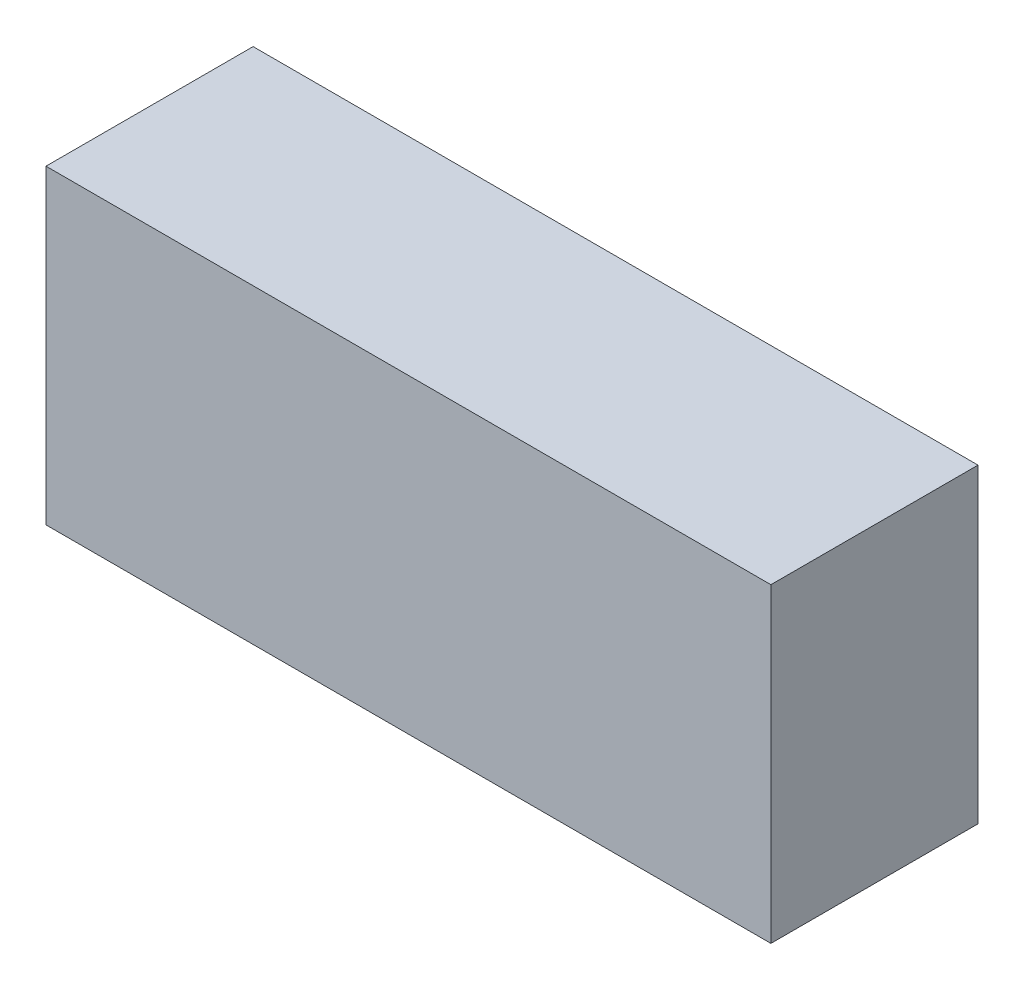
ISO-10303-21;
HEADER;
FILE_DESCRIPTION(('STEP AP214'),'2;1');
FILE_NAME('part.step','',(''),(''),'','','');
FILE_SCHEMA(('AUTOMOTIVE_DESIGN { 1 0 10303 214 1 1 1 1 }'));
ENDSEC;
DATA;
#1=APPLICATION_CONTEXT('core data for automotive mechanical design processes');
#2=APPLICATION_PROTOCOL_DEFINITION('international standard','automotive_design',2000,#1);
#3=PRODUCT_CONTEXT('',#1,'mechanical');
#4=PRODUCT('Part','Part','',(#3));
#5=PRODUCT_RELATED_PRODUCT_CATEGORY('part','',(#4));
#6=PRODUCT_DEFINITION_FORMATION('','',#4);
#7=PRODUCT_DEFINITION_CONTEXT('part definition',#1,'design');
#8=PRODUCT_DEFINITION('design','',#6,#7);
#9=PRODUCT_DEFINITION_SHAPE('','',#8);
#10=(LENGTH_UNIT() NAMED_UNIT(*) SI_UNIT(.MILLI.,.METRE.));
#11=(NAMED_UNIT(*) PLANE_ANGLE_UNIT() SI_UNIT($,.RADIAN.));
#12=(NAMED_UNIT(*) SI_UNIT($,.STERADIAN.) SOLID_ANGLE_UNIT());
#13=UNCERTAINTY_MEASURE_WITH_UNIT(LENGTH_MEASURE(1.E-05),#10,'distance_accuracy_value','');
#14=(GEOMETRIC_REPRESENTATION_CONTEXT(3) GLOBAL_UNCERTAINTY_ASSIGNED_CONTEXT((#13)) GLOBAL_UNIT_ASSIGNED_CONTEXT((#10,
#11,#12)) REPRESENTATION_CONTEXT('',''));
#15=CARTESIAN_POINT('',(0.,0.,0.));
#16=DIRECTION('',(0.,0.,1.));
#17=DIRECTION('',(1.,0.,0.));
#18=AXIS2_PLACEMENT_3D('',#15,#16,#17);
#19=CARTESIAN_POINT('',(0.,0.,50.8));
#20=DIRECTION('',(1.,0.,0.));
#21=DIRECTION('',(0.,0.,-1.));
#22=AXIS2_PLACEMENT_3D('',#19,#20,#21);
#23=PLANE('',#22);
#24=DIRECTION('',(0.,-1.,0.));
#25=VECTOR('',#24,1.);
#26=CARTESIAN_POINT('',(0.,0.,0.));
#27=LINE('',#26,#25);
#28=CARTESIAN_POINT('',(0.,76.2,0.));
#29=VERTEX_POINT('',#28);
#30=CARTESIAN_POINT('',(0.,0.,0.));
#31=VERTEX_POINT('',#30);
#32=EDGE_CURVE('E96',#29,#31,#27,.T.);
#33=ORIENTED_EDGE('',*,*,#32,.T.);
#34=DIRECTION('',(0.,0.,-1.));
#35=VECTOR('',#34,1.);
#36=CARTESIAN_POINT('',(0.,0.,50.8));
#37=LINE('',#36,#35);
#38=CARTESIAN_POINT('',(0.,0.,50.8));
#39=VERTEX_POINT('',#38);
#40=EDGE_CURVE('E11',#39,#31,#37,.T.);
#41=ORIENTED_EDGE('',*,*,#40,.F.);
#42=DIRECTION('',(0.,-1.,0.));
#43=VECTOR('',#42,1.);
#44=CARTESIAN_POINT('',(0.,0.,50.8));
#45=LINE('',#44,#43);
#46=CARTESIAN_POINT('',(0.,76.2,50.8));
#47=VERTEX_POINT('',#46);
#48=EDGE_CURVE('E84',#47,#39,#45,.T.);
#49=ORIENTED_EDGE('',*,*,#48,.F.);
#50=DIRECTION('',(0.,0.,-1.));
#51=VECTOR('',#50,1.);
#52=CARTESIAN_POINT('',(0.,76.2,50.8));
#53=LINE('',#52,#51);
#54=EDGE_CURVE('E92',#47,#29,#53,.T.);
#55=ORIENTED_EDGE('',*,*,#54,.T.);
#56=EDGE_LOOP('',(#33,#41,#49,#55));
#57=FACE_BOUND('',#56,.T.);
#58=ADVANCED_FACE('F33',(#57),#23,.F.);
#59=CARTESIAN_POINT('',(0.,0.,50.8));
#60=DIRECTION('',(0.,1.,0.));
#61=DIRECTION('',(0.,0.,1.));
#62=AXIS2_PLACEMENT_3D('',#59,#60,#61);
#63=PLANE('',#62);
#64=DIRECTION('',(1.,0.,0.));
#65=VECTOR('',#64,1.);
#66=CARTESIAN_POINT('',(0.,0.,0.));
#67=LINE('',#66,#65);
#68=CARTESIAN_POINT('',(177.8,0.,0.));
#69=VERTEX_POINT('',#68);
#70=EDGE_CURVE('E88',#31,#69,#67,.T.);
#71=ORIENTED_EDGE('',*,*,#70,.T.);
#72=DIRECTION('',(0.,0.,-1.));
#73=VECTOR('',#72,1.);
#74=CARTESIAN_POINT('',(177.8,0.,50.8));
#75=LINE('',#74,#73);
#76=CARTESIAN_POINT('',(177.8,0.,50.8));
#77=VERTEX_POINT('',#76);
#78=EDGE_CURVE('E41',#77,#69,#75,.T.);
#79=ORIENTED_EDGE('',*,*,#78,.F.);
#80=DIRECTION('',(1.,0.,0.));
#81=VECTOR('',#80,1.);
#82=CARTESIAN_POINT('',(0.,0.,50.8));
#83=LINE('',#82,#81);
#84=EDGE_CURVE('E79',#39,#77,#83,.T.);
#85=ORIENTED_EDGE('',*,*,#84,.F.);
#86=ORIENTED_EDGE('',*,*,#40,.T.);
#87=EDGE_LOOP('',(#71,#79,#85,#86));
#88=FACE_BOUND('',#87,.T.);
#89=ADVANCED_FACE('F87',(#88),#63,.F.);
#90=CARTESIAN_POINT('',(177.8,0.,50.8));
#91=DIRECTION('',(-1.,0.,0.));
#92=DIRECTION('',(0.,0.,1.));
#93=AXIS2_PLACEMENT_3D('',#90,#91,#92);
#94=PLANE('',#93);
#95=DIRECTION('',(0.,1.,0.));
#96=VECTOR('',#95,1.);
#97=CARTESIAN_POINT('',(177.8,0.,0.));
#98=LINE('',#97,#96);
#99=CARTESIAN_POINT('',(177.8,76.2,0.));
#100=VERTEX_POINT('',#99);
#101=EDGE_CURVE('E66',#69,#100,#98,.T.);
#102=ORIENTED_EDGE('',*,*,#101,.T.);
#103=DIRECTION('',(0.,0.,-1.));
#104=VECTOR('',#103,1.);
#105=CARTESIAN_POINT('',(177.8,76.2,50.8));
#106=LINE('',#105,#104);
#107=CARTESIAN_POINT('',(177.8,76.2,50.8));
#108=VERTEX_POINT('',#107);
#109=EDGE_CURVE('E89',#108,#100,#106,.T.);
#110=ORIENTED_EDGE('',*,*,#109,.F.);
#111=DIRECTION('',(0.,1.,0.));
#112=VECTOR('',#111,1.);
#113=CARTESIAN_POINT('',(177.8,0.,50.8));
#114=LINE('',#113,#112);
#115=EDGE_CURVE('E82',#77,#108,#114,.T.);
#116=ORIENTED_EDGE('',*,*,#115,.F.);
#117=ORIENTED_EDGE('',*,*,#78,.T.);
#118=EDGE_LOOP('',(#102,#110,#116,#117));
#119=FACE_BOUND('',#118,.T.);
#120=ADVANCED_FACE('F90',(#119),#94,.F.);
#121=CARTESIAN_POINT('',(0.,76.2,50.8));
#122=DIRECTION('',(0.,-1.,0.));
#123=DIRECTION('',(0.,0.,-1.));
#124=AXIS2_PLACEMENT_3D('',#121,#122,#123);
#125=PLANE('',#124);
#126=DIRECTION('',(-1.,0.,0.));
#127=VECTOR('',#126,1.);
#128=CARTESIAN_POINT('',(0.,76.2,0.));
#129=LINE('',#128,#127);
#130=EDGE_CURVE('E72',#100,#29,#129,.T.);
#131=ORIENTED_EDGE('',*,*,#130,.T.);
#132=ORIENTED_EDGE('',*,*,#54,.F.);
#133=DIRECTION('',(-1.,0.,0.));
#134=VECTOR('',#133,1.);
#135=CARTESIAN_POINT('',(0.,76.2,50.8));
#136=LINE('',#135,#134);
#137=EDGE_CURVE('E49',#108,#47,#136,.T.);
#138=ORIENTED_EDGE('',*,*,#137,.F.);
#139=ORIENTED_EDGE('',*,*,#109,.T.);
#140=EDGE_LOOP('',(#131,#132,#138,#139));
#141=FACE_BOUND('',#140,.T.);
#142=ADVANCED_FACE('F103',(#141),#125,.F.);
#143=CARTESIAN_POINT('',(0.,0.,50.8));
#144=DIRECTION('',(0.,0.,-1.));
#145=DIRECTION('',(-1.,0.,0.));
#146=AXIS2_PLACEMENT_3D('',#143,#144,#145);
#147=PLANE('',#146);
#148=ORIENTED_EDGE('',*,*,#48,.T.);
#149=ORIENTED_EDGE('',*,*,#84,.T.);
#150=ORIENTED_EDGE('',*,*,#115,.T.);
#151=ORIENTED_EDGE('',*,*,#137,.T.);
#152=EDGE_LOOP('',(#148,#149,#150,#151));
#153=FACE_BOUND('',#152,.T.);
#154=ADVANCED_FACE('F80',(#153),#147,.F.);
#155=CARTESIAN_POINT('',(0.,0.,0.));
#156=DIRECTION('',(0.,0.,-1.));
#157=DIRECTION('',(-1.,0.,0.));
#158=AXIS2_PLACEMENT_3D('',#155,#156,#157);
#159=PLANE('',#158);
#160=ORIENTED_EDGE('',*,*,#32,.F.);
#161=ORIENTED_EDGE('',*,*,#130,.F.);
#162=ORIENTED_EDGE('',*,*,#101,.F.);
#163=ORIENTED_EDGE('',*,*,#70,.F.);
#164=EDGE_LOOP('',(#160,#161,#162,#163));
#165=FACE_BOUND('',#164,.T.);
#166=ADVANCED_FACE('F106',(#165),#159,.T.);
#167=CLOSED_SHELL('',(#58,#89,#120,#142,#154,#166));
#168=MANIFOLD_SOLID_BREP('B2',#167);
#169=ADVANCED_BREP_SHAPE_REPRESENTATION('',(#18,#168),#14);
#170=SHAPE_DEFINITION_REPRESENTATION(#9,#169);
ENDSEC;
END-ISO-10303-21;
